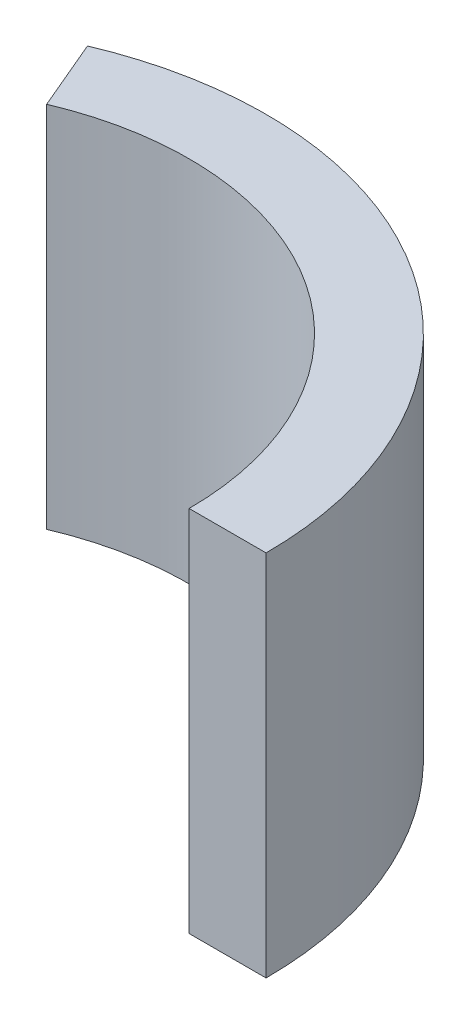
ISO-10303-21;
HEADER;
FILE_DESCRIPTION(('STEP AP214'),'2;1');
FILE_NAME('part.step','',(''),(''),'','','');
FILE_SCHEMA(('AUTOMOTIVE_DESIGN { 1 0 10303 214 1 1 1 1 }'));
ENDSEC;
DATA;
#1=APPLICATION_CONTEXT('core data for automotive mechanical design processes');
#2=APPLICATION_PROTOCOL_DEFINITION('international standard','automotive_design',2000,#1);
#3=PRODUCT_CONTEXT('',#1,'mechanical');
#4=PRODUCT('Part','Part','',(#3));
#5=PRODUCT_RELATED_PRODUCT_CATEGORY('part','',(#4));
#6=PRODUCT_DEFINITION_FORMATION('','',#4);
#7=PRODUCT_DEFINITION_CONTEXT('part definition',#1,'design');
#8=PRODUCT_DEFINITION('design','',#6,#7);
#9=PRODUCT_DEFINITION_SHAPE('','',#8);
#10=(LENGTH_UNIT() NAMED_UNIT(*) SI_UNIT(.MILLI.,.METRE.));
#11=(NAMED_UNIT(*) PLANE_ANGLE_UNIT() SI_UNIT($,.RADIAN.));
#12=(NAMED_UNIT(*) SI_UNIT($,.STERADIAN.) SOLID_ANGLE_UNIT());
#13=UNCERTAINTY_MEASURE_WITH_UNIT(LENGTH_MEASURE(1.E-05),#10,'distance_accuracy_value','');
#14=(GEOMETRIC_REPRESENTATION_CONTEXT(3) GLOBAL_UNCERTAINTY_ASSIGNED_CONTEXT((#13)) GLOBAL_UNIT_ASSIGNED_CONTEXT((#10,
#11,#12)) REPRESENTATION_CONTEXT('',''));
#15=CARTESIAN_POINT('',(0.,0.,0.));
#16=DIRECTION('',(0.,0.,1.));
#17=DIRECTION('',(1.,0.,0.));
#18=AXIS2_PLACEMENT_3D('',#15,#16,#17);
#19=CARTESIAN_POINT('',(4.,-13.,0.));
#20=DIRECTION('',(0.,-1.,0.));
#21=DIRECTION('',(0.,0.,-1.));
#22=AXIS2_PLACEMENT_3D('',#19,#20,#21);
#23=CYLINDRICAL_SURFACE('',#22,22.7);
#24=CARTESIAN_POINT('',(4.,-4.,0.));
#25=DIRECTION('',(0.,-1.,0.));
#26=DIRECTION('',(0.,0.,-1.));
#27=AXIS2_PLACEMENT_3D('',#24,#25,#26);
#28=CIRCLE('',#27,22.7);
#29=CARTESIAN_POINT('',(-4.86959661670652,-4.,-20.8954601733704));
#30=VERTEX_POINT('',#29);
#31=CARTESIAN_POINT('',(26.7,-4.,0.));
#32=VERTEX_POINT('',#31);
#33=EDGE_CURVE('E11',#30,#32,#28,.T.);
#34=ORIENTED_EDGE('',*,*,#33,.F.);
#35=DIRECTION('',(0.,1.,0.));
#36=VECTOR('',#35,1.);
#37=CARTESIAN_POINT('',(-4.86959661670652,-4.,-20.8954601733704));
#38=LINE('',#37,#36);
#39=CARTESIAN_POINT('',(-4.86959661670652,18.,-20.8954601733704));
#40=VERTEX_POINT('',#39);
#41=EDGE_CURVE('E87',#30,#40,#38,.T.);
#42=ORIENTED_EDGE('',*,*,#41,.T.);
#43=CARTESIAN_POINT('',(4.,18.,0.));
#44=DIRECTION('',(0.,-1.,0.));
#45=DIRECTION('',(0.,0.,-1.));
#46=AXIS2_PLACEMENT_3D('',#43,#44,#45);
#47=CIRCLE('',#46,22.7);
#48=CARTESIAN_POINT('',(26.7,18.,0.));
#49=VERTEX_POINT('',#48);
#50=EDGE_CURVE('E85',#40,#49,#47,.T.);
#51=ORIENTED_EDGE('',*,*,#50,.T.);
#52=DIRECTION('',(0.,1.,0.));
#53=VECTOR('',#52,1.);
#54=CARTESIAN_POINT('',(26.7,-4.,0.));
#55=LINE('',#54,#53);
#56=EDGE_CURVE('E84',#32,#49,#55,.T.);
#57=ORIENTED_EDGE('',*,*,#56,.F.);
#58=EDGE_LOOP('',(#34,#42,#51,#57));
#59=FACE_BOUND('',#58,.T.);
#60=ADVANCED_FACE('F44',(#59),#23,.T.);
#61=CARTESIAN_POINT('',(-4.86959661670652,-4.,-20.8954601733704));
#62=DIRECTION('',(0.,1.,0.));
#63=DIRECTION('',(0.,0.,1.));
#64=AXIS2_PLACEMENT_3D('',#61,#62,#63);
#65=PLANE('',#64);
#66=CARTESIAN_POINT('',(4.,-4.,0.));
#67=DIRECTION('',(0.,-1.,0.));
#68=DIRECTION('',(0.,0.,-1.));
#69=AXIS2_PLACEMENT_3D('',#66,#67,#68);
#70=CIRCLE('',#69,18.1);
#71=CARTESIAN_POINT('',(-3.07223342565586,-4.,-16.6611378474892));
#72=VERTEX_POINT('',#71);
#73=CARTESIAN_POINT('',(22.1,-4.,0.));
#74=VERTEX_POINT('',#73);
#75=EDGE_CURVE('E53',#72,#74,#70,.T.);
#76=ORIENTED_EDGE('',*,*,#75,.F.);
#77=DIRECTION('',(0.390731128489274,0.,0.92050485345244));
#78=VECTOR('',#77,1.);
#79=CARTESIAN_POINT('',(-4.86959661670652,-4.,-20.8954601733704));
#80=LINE('',#79,#78);
#81=EDGE_CURVE('E91',#30,#72,#80,.T.);
#82=ORIENTED_EDGE('',*,*,#81,.F.);
#83=ORIENTED_EDGE('',*,*,#33,.T.);
#84=DIRECTION('',(-1.,0.,0.));
#85=VECTOR('',#84,1.);
#86=CARTESIAN_POINT('',(26.7,-4.,0.));
#87=LINE('',#86,#85);
#88=EDGE_CURVE('E106',#32,#74,#87,.T.);
#89=ORIENTED_EDGE('',*,*,#88,.T.);
#90=EDGE_LOOP('',(#76,#82,#83,#89));
#91=FACE_BOUND('',#90,.T.);
#92=ADVANCED_FACE('F50',(#91),#65,.F.);
#93=CARTESIAN_POINT('',(4.,-13.,0.));
#94=DIRECTION('',(0.,-1.,0.));
#95=DIRECTION('',(0.,0.,-1.));
#96=AXIS2_PLACEMENT_3D('',#93,#94,#95);
#97=CYLINDRICAL_SURFACE('',#96,18.1);
#98=CARTESIAN_POINT('',(4.,18.,0.));
#99=DIRECTION('',(0.,-1.,0.));
#100=DIRECTION('',(0.,0.,-1.));
#101=AXIS2_PLACEMENT_3D('',#98,#99,#100);
#102=CIRCLE('',#101,18.1);
#103=CARTESIAN_POINT('',(-3.07223342565586,18.,-16.6611378474892));
#104=VERTEX_POINT('',#103);
#105=CARTESIAN_POINT('',(22.1,18.,0.));
#106=VERTEX_POINT('',#105);
#107=EDGE_CURVE('E95',#104,#106,#102,.T.);
#108=ORIENTED_EDGE('',*,*,#107,.F.);
#109=DIRECTION('',(0.,1.,0.));
#110=VECTOR('',#109,1.);
#111=CARTESIAN_POINT('',(-3.07223342565586,-4.,-16.6611378474892));
#112=LINE('',#111,#110);
#113=EDGE_CURVE('E116',#72,#104,#112,.T.);
#114=ORIENTED_EDGE('',*,*,#113,.F.);
#115=ORIENTED_EDGE('',*,*,#75,.T.);
#116=DIRECTION('',(0.,1.,0.));
#117=VECTOR('',#116,1.);
#118=CARTESIAN_POINT('',(22.1,-4.,0.));
#119=LINE('',#118,#117);
#120=EDGE_CURVE('E105',#74,#106,#119,.T.);
#121=ORIENTED_EDGE('',*,*,#120,.T.);
#122=EDGE_LOOP('',(#108,#114,#115,#121));
#123=FACE_BOUND('',#122,.T.);
#124=ADVANCED_FACE('F129',(#123),#97,.F.);
#125=CARTESIAN_POINT('',(-3.07223342565586,18.,-16.6611378474892));
#126=DIRECTION('',(0.,-1.,0.));
#127=DIRECTION('',(0.,0.,-1.));
#128=AXIS2_PLACEMENT_3D('',#125,#126,#127);
#129=PLANE('',#128);
#130=DIRECTION('',(-0.390731128489274,0.,-0.92050485345244));
#131=VECTOR('',#130,1.);
#132=CARTESIAN_POINT('',(-3.07223342565586,18.,-16.6611378474892));
#133=LINE('',#132,#131);
#134=EDGE_CURVE('E117',#104,#40,#133,.T.);
#135=ORIENTED_EDGE('',*,*,#134,.F.);
#136=ORIENTED_EDGE('',*,*,#107,.T.);
#137=DIRECTION('',(1.,0.,0.));
#138=VECTOR('',#137,1.);
#139=CARTESIAN_POINT('',(22.1,18.,0.));
#140=LINE('',#139,#138);
#141=EDGE_CURVE('E96',#106,#49,#140,.T.);
#142=ORIENTED_EDGE('',*,*,#141,.T.);
#143=ORIENTED_EDGE('',*,*,#50,.F.);
#144=EDGE_LOOP('',(#135,#136,#142,#143));
#145=FACE_BOUND('',#144,.T.);
#146=ADVANCED_FACE('F100',(#145),#129,.F.);
#147=CARTESIAN_POINT('',(5.5629245139571,0.,3.68201941380976));
#148=DIRECTION('',(-0.92050485345244,0.,0.390731128489274));
#149=DIRECTION('',(0.390731128489274,0.,0.92050485345244));
#150=AXIS2_PLACEMENT_3D('',#147,#148,#149);
#151=PLANE('',#150);
#152=ORIENTED_EDGE('',*,*,#41,.F.);
#153=ORIENTED_EDGE('',*,*,#81,.T.);
#154=ORIENTED_EDGE('',*,*,#113,.T.);
#155=ORIENTED_EDGE('',*,*,#134,.T.);
#156=EDGE_LOOP('',(#152,#153,#154,#155));
#157=FACE_BOUND('',#156,.T.);
#158=ADVANCED_FACE('F132',(#157),#151,.T.);
#159=CARTESIAN_POINT('',(0.,0.,0.));
#160=DIRECTION('',(0.,0.,-1.));
#161=DIRECTION('',(-1.,0.,0.));
#162=AXIS2_PLACEMENT_3D('',#159,#160,#161);
#163=PLANE('',#162);
#164=ORIENTED_EDGE('',*,*,#56,.T.);
#165=ORIENTED_EDGE('',*,*,#141,.F.);
#166=ORIENTED_EDGE('',*,*,#120,.F.);
#167=ORIENTED_EDGE('',*,*,#88,.F.);
#168=EDGE_LOOP('',(#164,#165,#166,#167));
#169=FACE_BOUND('',#168,.T.);
#170=ADVANCED_FACE('F104',(#169),#163,.F.);
#171=CLOSED_SHELL('',(#60,#92,#124,#146,#158,#170));
#172=MANIFOLD_SOLID_BREP('B2',#171);
#173=ADVANCED_BREP_SHAPE_REPRESENTATION('',(#18,#172),#14);
#174=SHAPE_DEFINITION_REPRESENTATION(#9,#173);
ENDSEC;
END-ISO-10303-21;
